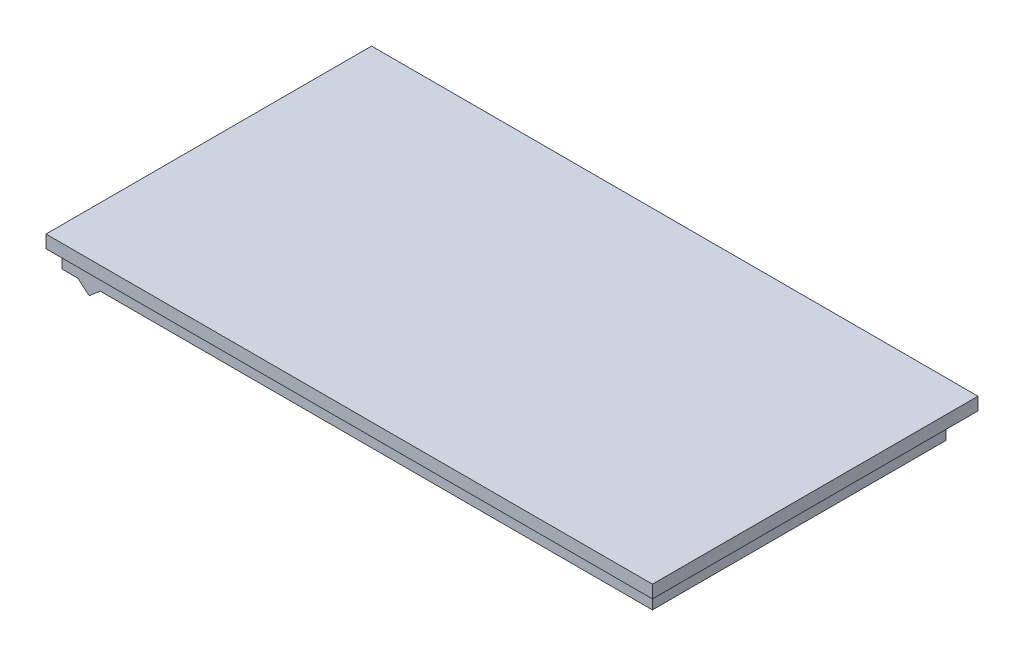
ISO-10303-21;
HEADER;
FILE_DESCRIPTION(('STEP AP214'),'2;1');
FILE_NAME('part.step','',(''),(''),'','','');
FILE_SCHEMA(('AUTOMOTIVE_DESIGN { 1 0 10303 214 1 1 1 1 }'));
ENDSEC;
DATA;
#1=APPLICATION_CONTEXT('core data for automotive mechanical design processes');
#2=APPLICATION_PROTOCOL_DEFINITION('international standard','automotive_design',2000,#1);
#3=PRODUCT_CONTEXT('',#1,'mechanical');
#4=PRODUCT('Part','Part','',(#3));
#5=PRODUCT_RELATED_PRODUCT_CATEGORY('part','',(#4));
#6=PRODUCT_DEFINITION_FORMATION('','',#4);
#7=PRODUCT_DEFINITION_CONTEXT('part definition',#1,'design');
#8=PRODUCT_DEFINITION('design','',#6,#7);
#9=PRODUCT_DEFINITION_SHAPE('','',#8);
#10=(LENGTH_UNIT() NAMED_UNIT(*) SI_UNIT(.MILLI.,.METRE.));
#11=(NAMED_UNIT(*) PLANE_ANGLE_UNIT() SI_UNIT($,.RADIAN.));
#12=(NAMED_UNIT(*) SI_UNIT($,.STERADIAN.) SOLID_ANGLE_UNIT());
#13=UNCERTAINTY_MEASURE_WITH_UNIT(LENGTH_MEASURE(1.E-05),#10,'distance_accuracy_value','');
#14=(GEOMETRIC_REPRESENTATION_CONTEXT(3) GLOBAL_UNCERTAINTY_ASSIGNED_CONTEXT((#13)) GLOBAL_UNIT_ASSIGNED_CONTEXT((#10,
#11,#12)) REPRESENTATION_CONTEXT('',''));
#15=CARTESIAN_POINT('',(0.,0.,0.));
#16=DIRECTION('',(0.,0.,1.));
#17=DIRECTION('',(1.,0.,0.));
#18=AXIS2_PLACEMENT_3D('',#15,#16,#17);
#19=CARTESIAN_POINT('',(0.,-4.,0.));
#20=DIRECTION('',(0.,1.,0.));
#21=DIRECTION('',(0.,0.,1.));
#22=AXIS2_PLACEMENT_3D('',#19,#20,#21);
#23=PLANE('',#22);
#24=DIRECTION('',(0.,0.,-1.));
#25=VECTOR('',#24,1.);
#26=CARTESIAN_POINT('',(2.5,-4.,-44.5));
#27=LINE('',#26,#25);
#28=CARTESIAN_POINT('',(2.5,-4.,-44.5));
#29=VERTEX_POINT('',#28);
#30=CARTESIAN_POINT('',(2.5,-4.,-48.5));
#31=VERTEX_POINT('',#30);
#32=EDGE_CURVE('E454',#29,#31,#27,.T.);
#33=ORIENTED_EDGE('',*,*,#32,.F.);
#34=DIRECTION('',(0.,0.,1.));
#35=VECTOR('',#34,1.);
#36=CARTESIAN_POINT('',(2.5,-4.,-48.5));
#37=LINE('',#36,#35);
#38=CARTESIAN_POINT('',(2.5,-4.,-6.5));
#39=VERTEX_POINT('',#38);
#40=EDGE_CURVE('E390',#29,#39,#37,.T.);
#41=ORIENTED_EDGE('',*,*,#40,.T.);
#42=DIRECTION('',(0.,0.,-1.));
#43=VECTOR('',#42,1.);
#44=CARTESIAN_POINT('',(2.5,-4.,-2.5));
#45=LINE('',#44,#43);
#46=CARTESIAN_POINT('',(2.5,-4.,-2.5));
#47=VERTEX_POINT('',#46);
#48=EDGE_CURVE('E199',#47,#39,#45,.T.);
#49=ORIENTED_EDGE('',*,*,#48,.F.);
#50=DIRECTION('',(-1.,0.,0.));
#51=VECTOR('',#50,1.);
#52=CARTESIAN_POINT('',(2.5,-4.,-2.5));
#53=LINE('',#52,#51);
#54=CARTESIAN_POINT('',(0.,-4.,-2.5));
#55=VERTEX_POINT('',#54);
#56=EDGE_CURVE('E216',#47,#55,#53,.T.);
#57=ORIENTED_EDGE('',*,*,#56,.T.);
#58=DIRECTION('',(0.,0.,1.));
#59=VECTOR('',#58,1.);
#60=CARTESIAN_POINT('',(0.,-4.,-48.5));
#61=LINE('',#60,#59);
#62=CARTESIAN_POINT('',(0.,-4.,-48.5));
#63=VERTEX_POINT('',#62);
#64=EDGE_CURVE('E403',#63,#55,#61,.T.);
#65=ORIENTED_EDGE('',*,*,#64,.F.);
#66=DIRECTION('',(1.,0.,0.));
#67=VECTOR('',#66,1.);
#68=CARTESIAN_POINT('',(2.5,-4.,-48.5));
#69=LINE('',#68,#67);
#70=EDGE_CURVE('E412',#63,#31,#69,.T.);
#71=ORIENTED_EDGE('',*,*,#70,.T.);
#72=EDGE_LOOP('',(#33,#41,#49,#57,#65,#71));
#73=FACE_BOUND('',#72,.T.);
#74=ADVANCED_FACE('F33',(#73),#23,.F.);
#75=DIRECTION('',(0.,0.,1.));
#76=VECTOR('',#75,1.);
#77=CARTESIAN_POINT('',(6.,-4.,-44.5));
#78=LINE('',#77,#76);
#79=CARTESIAN_POINT('',(6.,-4.,-48.5));
#80=VERTEX_POINT('',#79);
#81=CARTESIAN_POINT('',(6.,-4.,-44.5));
#82=VERTEX_POINT('',#81);
#83=EDGE_CURVE('E386',#80,#82,#78,.T.);
#84=ORIENTED_EDGE('',*,*,#83,.F.);
#85=CARTESIAN_POINT('',(92.5,-4.,-48.5));
#86=VERTEX_POINT('',#85);
#87=EDGE_CURVE('E416',#80,#86,#69,.T.);
#88=ORIENTED_EDGE('',*,*,#87,.T.);
#89=DIRECTION('',(0.,0.,1.));
#90=VECTOR('',#89,1.);
#91=CARTESIAN_POINT('',(92.5,-4.,-4.49999999999999));
#92=LINE('',#91,#90);
#93=CARTESIAN_POINT('',(92.5,-4.,-2.49999999999999));
#94=VERTEX_POINT('',#93);
#95=EDGE_CURVE('E213',#86,#94,#92,.T.);
#96=ORIENTED_EDGE('',*,*,#95,.T.);
#97=CARTESIAN_POINT('',(6.,-4.,-2.5));
#98=VERTEX_POINT('',#97);
#99=EDGE_CURVE('E206',#94,#98,#53,.T.);
#100=ORIENTED_EDGE('',*,*,#99,.T.);
#101=DIRECTION('',(0.,0.,1.));
#102=VECTOR('',#101,1.);
#103=CARTESIAN_POINT('',(6.,-4.,-2.5));
#104=LINE('',#103,#102);
#105=CARTESIAN_POINT('',(6.,-4.,-6.5));
#106=VERTEX_POINT('',#105);
#107=EDGE_CURVE('E190',#106,#98,#104,.T.);
#108=ORIENTED_EDGE('',*,*,#107,.F.);
#109=DIRECTION('',(1.,0.,0.));
#110=VECTOR('',#109,1.);
#111=CARTESIAN_POINT('',(2.5,-4.,-6.5));
#112=LINE('',#111,#110);
#113=CARTESIAN_POINT('',(90.5,-4.,-6.49999999999999));
#114=VERTEX_POINT('',#113);
#115=EDGE_CURVE('E57',#106,#114,#112,.T.);
#116=ORIENTED_EDGE('',*,*,#115,.T.);
#117=DIRECTION('',(0.,0.,-1.));
#118=VECTOR('',#117,1.);
#119=CARTESIAN_POINT('',(90.5,-4.,-4.49999999999999));
#120=LINE('',#119,#118);
#121=CARTESIAN_POINT('',(90.5,-4.,-44.5));
#122=VERTEX_POINT('',#121);
#123=EDGE_CURVE('E240',#114,#122,#120,.T.);
#124=ORIENTED_EDGE('',*,*,#123,.T.);
#125=DIRECTION('',(-1.,0.,0.));
#126=VECTOR('',#125,1.);
#127=CARTESIAN_POINT('',(2.5,-4.,-44.5));
#128=LINE('',#127,#126);
#129=EDGE_CURVE('E415',#122,#82,#128,.T.);
#130=ORIENTED_EDGE('',*,*,#129,.T.);
#131=EDGE_LOOP('',(#84,#88,#96,#100,#108,#116,#124,#130));
#132=FACE_BOUND('',#131,.T.);
#133=ADVANCED_FACE('F211',(#132),#23,.F.);
#134=CARTESIAN_POINT('',(0.,0.,0.));
#135=DIRECTION('',(0.,-1.,0.));
#136=DIRECTION('',(0.,0.,-1.));
#137=AXIS2_PLACEMENT_3D('',#134,#135,#136);
#138=PLANE('',#137);
#139=DIRECTION('',(1.,0.,0.));
#140=VECTOR('',#139,1.);
#141=CARTESIAN_POINT('',(2.5,0.,-6.5));
#142=LINE('',#141,#140);
#143=CARTESIAN_POINT('',(2.5,0.,-6.5));
#144=VERTEX_POINT('',#143);
#145=CARTESIAN_POINT('',(90.5,0.,-6.49999999999999));
#146=VERTEX_POINT('',#145);
#147=EDGE_CURVE('E262',#144,#146,#142,.T.);
#148=ORIENTED_EDGE('',*,*,#147,.F.);
#149=DIRECTION('',(0.,0.,-1.));
#150=VECTOR('',#149,1.);
#151=CARTESIAN_POINT('',(2.5,0.,-48.5));
#152=LINE('',#151,#150);
#153=CARTESIAN_POINT('',(2.5,0.,-44.5));
#154=VERTEX_POINT('',#153);
#155=EDGE_CURVE('E401',#144,#154,#152,.T.);
#156=ORIENTED_EDGE('',*,*,#155,.T.);
#157=DIRECTION('',(-1.,0.,0.));
#158=VECTOR('',#157,1.);
#159=CARTESIAN_POINT('',(2.5,0.,-44.5));
#160=LINE('',#159,#158);
#161=CARTESIAN_POINT('',(90.5,0.,-44.5));
#162=VERTEX_POINT('',#161);
#163=EDGE_CURVE('E251',#162,#154,#160,.T.);
#164=ORIENTED_EDGE('',*,*,#163,.F.);
#165=DIRECTION('',(0.,0.,-1.));
#166=VECTOR('',#165,1.);
#167=CARTESIAN_POINT('',(90.5,0.,-4.49999999999999));
#168=LINE('',#167,#166);
#169=EDGE_CURVE('E218',#146,#162,#168,.T.);
#170=ORIENTED_EDGE('',*,*,#169,.F.);
#171=EDGE_LOOP('',(#148,#156,#164,#170));
#172=FACE_BOUND('',#171,.T.);
#173=ADVANCED_FACE('F353',(#172),#138,.T.);
#174=CARTESIAN_POINT('',(90.5,-4.,-4.49999999999999));
#175=DIRECTION('',(1.,0.,0.));
#176=DIRECTION('',(0.,0.,-1.));
#177=AXIS2_PLACEMENT_3D('',#174,#175,#176);
#178=PLANE('',#177);
#179=DIRECTION('',(0.,-1.,0.));
#180=VECTOR('',#179,1.);
#181=CARTESIAN_POINT('',(90.5,-2.,-44.5));
#182=LINE('',#181,#180);
#183=EDGE_CURVE('E50',#162,#122,#182,.T.);
#184=ORIENTED_EDGE('',*,*,#183,.T.);
#185=ORIENTED_EDGE('',*,*,#123,.F.);
#186=DIRECTION('',(0.,1.,0.));
#187=VECTOR('',#186,1.);
#188=CARTESIAN_POINT('',(90.5,-2.,-6.49999999999999));
#189=LINE('',#188,#187);
#190=EDGE_CURVE('E244',#114,#146,#189,.T.);
#191=ORIENTED_EDGE('',*,*,#190,.T.);
#192=ORIENTED_EDGE('',*,*,#169,.T.);
#193=EDGE_LOOP('',(#184,#185,#191,#192));
#194=FACE_BOUND('',#193,.T.);
#195=ADVANCED_FACE('F358',(#194),#178,.F.);
#196=CARTESIAN_POINT('',(2.5,-2.,-46.5));
#197=DIRECTION('',(0.,0.,1.));
#198=DIRECTION('',(1.,0.,0.));
#199=AXIS2_PLACEMENT_3D('',#196,#197,#198);
#200=PLANE('',#199);
#201=DIRECTION('',(0.,1.,0.));
#202=VECTOR('',#201,1.);
#203=CARTESIAN_POINT('',(92.5,-2.,-46.5));
#204=LINE('',#203,#202);
#205=CARTESIAN_POINT('',(92.5,-2.,-46.5));
#206=VERTEX_POINT('',#205);
#207=CARTESIAN_POINT('',(92.5,0.,-46.5));
#208=VERTEX_POINT('',#207);
#209=EDGE_CURVE('E257',#206,#208,#204,.T.);
#210=ORIENTED_EDGE('',*,*,#209,.F.);
#211=DIRECTION('',(1.,0.,0.));
#212=VECTOR('',#211,1.);
#213=CARTESIAN_POINT('',(2.5,-2.,-46.5));
#214=LINE('',#213,#212);
#215=CARTESIAN_POINT('',(2.5,-2.,-46.5));
#216=VERTEX_POINT('',#215);
#217=EDGE_CURVE('E248',#216,#206,#214,.T.);
#218=ORIENTED_EDGE('',*,*,#217,.F.);
#219=DIRECTION('',(0.,1.,0.));
#220=VECTOR('',#219,1.);
#221=CARTESIAN_POINT('',(2.5,-2.,-46.5));
#222=LINE('',#221,#220);
#223=CARTESIAN_POINT('',(2.5,0.,-46.5));
#224=VERTEX_POINT('',#223);
#225=EDGE_CURVE('E259',#216,#224,#222,.T.);
#226=ORIENTED_EDGE('',*,*,#225,.T.);
#227=DIRECTION('',(1.,0.,0.));
#228=VECTOR('',#227,1.);
#229=CARTESIAN_POINT('',(2.5,0.,-46.5));
#230=LINE('',#229,#228);
#231=EDGE_CURVE('E247',#224,#208,#230,.T.);
#232=ORIENTED_EDGE('',*,*,#231,.T.);
#233=EDGE_LOOP('',(#210,#218,#226,#232));
#234=FACE_BOUND('',#233,.T.);
#235=ADVANCED_FACE('F361',(#234),#200,.F.);
#236=DIRECTION('',(-1.,0.,0.));
#237=VECTOR('',#236,1.);
#238=CARTESIAN_POINT('',(2.5,0.,-2.5));
#239=LINE('',#238,#237);
#240=CARTESIAN_POINT('',(2.5,0.,-2.5));
#241=VERTEX_POINT('',#240);
#242=CARTESIAN_POINT('',(0.,0.,-2.5));
#243=VERTEX_POINT('',#242);
#244=EDGE_CURVE('E400',#241,#243,#239,.T.);
#245=ORIENTED_EDGE('',*,*,#244,.F.);
#246=CARTESIAN_POINT('',(2.5,0.,-4.5));
#247=VERTEX_POINT('',#246);
#248=EDGE_CURVE('E397',#241,#247,#152,.T.);
#249=ORIENTED_EDGE('',*,*,#248,.T.);
#250=DIRECTION('',(-1.,0.,0.));
#251=VECTOR('',#250,1.);
#252=CARTESIAN_POINT('',(2.5,0.,-4.5));
#253=LINE('',#252,#251);
#254=CARTESIAN_POINT('',(92.5,0.,-4.49999999999999));
#255=VERTEX_POINT('',#254);
#256=EDGE_CURVE('E267',#255,#247,#253,.T.);
#257=ORIENTED_EDGE('',*,*,#256,.F.);
#258=DIRECTION('',(0.,0.,1.));
#259=VECTOR('',#258,1.);
#260=CARTESIAN_POINT('',(92.5,0.,-6.49999999999999));
#261=LINE('',#260,#259);
#262=EDGE_CURVE('E270',#208,#255,#261,.T.);
#263=ORIENTED_EDGE('',*,*,#262,.F.);
#264=ORIENTED_EDGE('',*,*,#231,.F.);
#265=CARTESIAN_POINT('',(2.5,0.,-48.5));
#266=VERTEX_POINT('',#265);
#267=EDGE_CURVE('E396',#224,#266,#152,.T.);
#268=ORIENTED_EDGE('',*,*,#267,.T.);
#269=DIRECTION('',(-1.,0.,0.));
#270=VECTOR('',#269,1.);
#271=CARTESIAN_POINT('',(2.5,0.,-48.5));
#272=LINE('',#271,#270);
#273=CARTESIAN_POINT('',(0.,0.,-48.5));
#274=VERTEX_POINT('',#273);
#275=EDGE_CURVE('E408',#266,#274,#272,.T.);
#276=ORIENTED_EDGE('',*,*,#275,.T.);
#277=DIRECTION('',(0.,0.,1.));
#278=VECTOR('',#277,1.);
#279=CARTESIAN_POINT('',(0.,0.,0.));
#280=LINE('',#279,#278);
#281=CARTESIAN_POINT('',(0.,0.,-51.));
#282=VERTEX_POINT('',#281);
#283=EDGE_CURVE('E286',#282,#274,#280,.T.);
#284=ORIENTED_EDGE('',*,*,#283,.F.);
#285=DIRECTION('',(-1.,0.,0.));
#286=VECTOR('',#285,1.);
#287=CARTESIAN_POINT('',(0.,0.,-51.));
#288=LINE('',#287,#286);
#289=CARTESIAN_POINT('',(95.,0.,-51.));
#290=VERTEX_POINT('',#289);
#291=EDGE_CURVE('E297',#290,#282,#288,.T.);
#292=ORIENTED_EDGE('',*,*,#291,.F.);
#293=DIRECTION('',(0.,0.,-1.));
#294=VECTOR('',#293,1.);
#295=CARTESIAN_POINT('',(95.,0.,-51.));
#296=LINE('',#295,#294);
#297=CARTESIAN_POINT('',(95.,0.,0.));
#298=VERTEX_POINT('',#297);
#299=EDGE_CURVE('E295',#298,#290,#296,.T.);
#300=ORIENTED_EDGE('',*,*,#299,.F.);
#301=DIRECTION('',(1.,0.,0.));
#302=VECTOR('',#301,1.);
#303=CARTESIAN_POINT('',(95.,0.,0.));
#304=LINE('',#303,#302);
#305=CARTESIAN_POINT('',(0.,0.,0.));
#306=VERTEX_POINT('',#305);
#307=EDGE_CURVE('E281',#306,#298,#304,.T.);
#308=ORIENTED_EDGE('',*,*,#307,.F.);
#309=EDGE_CURVE('E299',#243,#306,#280,.T.);
#310=ORIENTED_EDGE('',*,*,#309,.F.);
#311=EDGE_LOOP('',(#245,#249,#257,#263,#264,#268,#276,#284,#292,#300,#308,#310));
#312=FACE_BOUND('',#311,.T.);
#313=ADVANCED_FACE('F323',(#312),#138,.T.);
#314=CARTESIAN_POINT('',(2.5,-2.,-6.5));
#315=DIRECTION('',(0.,0.,1.));
#316=DIRECTION('',(1.,0.,0.));
#317=AXIS2_PLACEMENT_3D('',#314,#315,#316);
#318=PLANE('',#317);
#319=ORIENTED_EDGE('',*,*,#115,.F.);
#320=DIRECTION('',(-0.759256602365297,-0.650791373455968,0.));
#321=VECTOR('',#320,1.);
#322=CARTESIAN_POINT('',(4.97058823529412,-4.88235294117647,-6.5));
#323=LINE('',#322,#321);
#324=CARTESIAN_POINT('',(4.25,-5.5,-6.5));
#325=VERTEX_POINT('',#324);
#326=EDGE_CURVE('E196',#106,#325,#323,.T.);
#327=ORIENTED_EDGE('',*,*,#326,.T.);
#328=DIRECTION('',(-0.759256602365297,0.650791373455968,0.));
#329=VECTOR('',#328,1.);
#330=CARTESIAN_POINT('',(1.51176470588235,-3.15294117647059,-6.5));
#331=LINE('',#330,#329);
#332=EDGE_CURVE('E457',#325,#39,#331,.T.);
#333=ORIENTED_EDGE('',*,*,#332,.T.);
#334=DIRECTION('',(0.,1.,0.));
#335=VECTOR('',#334,1.);
#336=CARTESIAN_POINT('',(2.5,-2.,-6.5));
#337=LINE('',#336,#335);
#338=EDGE_CURVE('E278',#39,#144,#337,.T.);
#339=ORIENTED_EDGE('',*,*,#338,.T.);
#340=ORIENTED_EDGE('',*,*,#147,.T.);
#341=ORIENTED_EDGE('',*,*,#190,.F.);
#342=EDGE_LOOP('',(#319,#327,#333,#339,#340,#341));
#343=FACE_BOUND('',#342,.T.);
#344=ADVANCED_FACE('F365',(#343),#318,.F.);
#345=CARTESIAN_POINT('',(2.5,-2.,-44.5));
#346=DIRECTION('',(0.,0.,-1.));
#347=DIRECTION('',(-1.,0.,0.));
#348=AXIS2_PLACEMENT_3D('',#345,#346,#347);
#349=PLANE('',#348);
#350=DIRECTION('',(0.759256602365297,-0.650791373455968,0.));
#351=VECTOR('',#350,1.);
#352=CARTESIAN_POINT('',(1.51176470588235,-3.15294117647059,-44.5));
#353=LINE('',#352,#351);
#354=CARTESIAN_POINT('',(4.25,-5.5,-44.5));
#355=VERTEX_POINT('',#354);
#356=EDGE_CURVE('E461',#29,#355,#353,.T.);
#357=ORIENTED_EDGE('',*,*,#356,.T.);
#358=DIRECTION('',(0.759256602365297,0.650791373455968,0.));
#359=VECTOR('',#358,1.);
#360=CARTESIAN_POINT('',(4.97058823529412,-4.88235294117647,-44.5));
#361=LINE('',#360,#359);
#362=EDGE_CURVE('E473',#355,#82,#361,.T.);
#363=ORIENTED_EDGE('',*,*,#362,.T.);
#364=ORIENTED_EDGE('',*,*,#129,.F.);
#365=ORIENTED_EDGE('',*,*,#183,.F.);
#366=ORIENTED_EDGE('',*,*,#163,.T.);
#367=DIRECTION('',(0.,1.,0.));
#368=VECTOR('',#367,1.);
#369=CARTESIAN_POINT('',(2.5,-2.,-44.5));
#370=LINE('',#369,#368);
#371=EDGE_CURVE('E250',#29,#154,#370,.T.);
#372=ORIENTED_EDGE('',*,*,#371,.F.);
#373=EDGE_LOOP('',(#357,#363,#364,#365,#366,#372));
#374=FACE_BOUND('',#373,.T.);
#375=ADVANCED_FACE('F362',(#374),#349,.F.);
#376=CARTESIAN_POINT('',(95.,2.,0.));
#377=DIRECTION('',(0.,0.,-1.));
#378=DIRECTION('',(-1.,0.,0.));
#379=AXIS2_PLACEMENT_3D('',#376,#377,#378);
#380=PLANE('',#379);
#381=ORIENTED_EDGE('',*,*,#307,.T.);
#382=DIRECTION('',(0.,-1.,0.));
#383=VECTOR('',#382,1.);
#384=CARTESIAN_POINT('',(95.,2.,0.));
#385=LINE('',#384,#383);
#386=CARTESIAN_POINT('',(95.,2.,0.));
#387=VERTEX_POINT('',#386);
#388=EDGE_CURVE('E42',#387,#298,#385,.T.);
#389=ORIENTED_EDGE('',*,*,#388,.F.);
#390=DIRECTION('',(1.,0.,0.));
#391=VECTOR('',#390,1.);
#392=CARTESIAN_POINT('',(95.,2.,0.));
#393=LINE('',#392,#391);
#394=CARTESIAN_POINT('',(0.,2.,0.));
#395=VERTEX_POINT('',#394);
#396=EDGE_CURVE('E282',#395,#387,#393,.T.);
#397=ORIENTED_EDGE('',*,*,#396,.F.);
#398=DIRECTION('',(0.,-1.,0.));
#399=VECTOR('',#398,1.);
#400=CARTESIAN_POINT('',(0.,2.,0.));
#401=LINE('',#400,#399);
#402=EDGE_CURVE('E292',#395,#306,#401,.T.);
#403=ORIENTED_EDGE('',*,*,#402,.T.);
#404=EDGE_LOOP('',(#381,#389,#397,#403));
#405=FACE_BOUND('',#404,.T.);
#406=ADVANCED_FACE('F35',(#405),#380,.F.);
#407=CARTESIAN_POINT('',(95.,2.,-51.));
#408=DIRECTION('',(-1.,0.,0.));
#409=DIRECTION('',(0.,0.,1.));
#410=AXIS2_PLACEMENT_3D('',#407,#408,#409);
#411=PLANE('',#410);
#412=ORIENTED_EDGE('',*,*,#299,.T.);
#413=DIRECTION('',(0.,-1.,0.));
#414=VECTOR('',#413,1.);
#415=CARTESIAN_POINT('',(95.,2.,-51.));
#416=LINE('',#415,#414);
#417=CARTESIAN_POINT('',(95.,2.,-51.));
#418=VERTEX_POINT('',#417);
#419=EDGE_CURVE('E306',#418,#290,#416,.T.);
#420=ORIENTED_EDGE('',*,*,#419,.F.);
#421=DIRECTION('',(0.,0.,-1.));
#422=VECTOR('',#421,1.);
#423=CARTESIAN_POINT('',(95.,2.,-51.));
#424=LINE('',#423,#422);
#425=EDGE_CURVE('E285',#387,#418,#424,.T.);
#426=ORIENTED_EDGE('',*,*,#425,.F.);
#427=ORIENTED_EDGE('',*,*,#388,.T.);
#428=EDGE_LOOP('',(#412,#420,#426,#427));
#429=FACE_BOUND('',#428,.T.);
#430=ADVANCED_FACE('F315',(#429),#411,.F.);
#431=CARTESIAN_POINT('',(0.,2.,-51.));
#432=DIRECTION('',(0.,0.,1.));
#433=DIRECTION('',(1.,0.,0.));
#434=AXIS2_PLACEMENT_3D('',#431,#432,#433);
#435=PLANE('',#434);
#436=ORIENTED_EDGE('',*,*,#291,.T.);
#437=DIRECTION('',(0.,-1.,0.));
#438=VECTOR('',#437,1.);
#439=CARTESIAN_POINT('',(0.,2.,-51.));
#440=LINE('',#439,#438);
#441=CARTESIAN_POINT('',(0.,2.,-51.));
#442=VERTEX_POINT('',#441);
#443=EDGE_CURVE('E304',#442,#282,#440,.T.);
#444=ORIENTED_EDGE('',*,*,#443,.F.);
#445=DIRECTION('',(-1.,0.,0.));
#446=VECTOR('',#445,1.);
#447=CARTESIAN_POINT('',(0.,2.,-51.));
#448=LINE('',#447,#446);
#449=EDGE_CURVE('E288',#418,#442,#448,.T.);
#450=ORIENTED_EDGE('',*,*,#449,.F.);
#451=ORIENTED_EDGE('',*,*,#419,.T.);
#452=EDGE_LOOP('',(#436,#444,#450,#451));
#453=FACE_BOUND('',#452,.T.);
#454=ADVANCED_FACE('F327',(#453),#435,.F.);
#455=CARTESIAN_POINT('',(0.,2.,0.));
#456=DIRECTION('',(1.,0.,0.));
#457=DIRECTION('',(0.,0.,-1.));
#458=AXIS2_PLACEMENT_3D('',#455,#456,#457);
#459=PLANE('',#458);
#460=ORIENTED_EDGE('',*,*,#283,.T.);
#461=DIRECTION('',(0.,-1.,0.));
#462=VECTOR('',#461,1.);
#463=CARTESIAN_POINT('',(0.,0.,-48.5));
#464=LINE('',#463,#462);
#465=EDGE_CURVE('E198',#274,#63,#464,.T.);
#466=ORIENTED_EDGE('',*,*,#465,.T.);
#467=ORIENTED_EDGE('',*,*,#64,.T.);
#468=DIRECTION('',(0.,1.,0.));
#469=VECTOR('',#468,1.);
#470=CARTESIAN_POINT('',(0.,0.,-2.5));
#471=LINE('',#470,#469);
#472=EDGE_CURVE('E391',#55,#243,#471,.T.);
#473=ORIENTED_EDGE('',*,*,#472,.T.);
#474=ORIENTED_EDGE('',*,*,#309,.T.);
#475=ORIENTED_EDGE('',*,*,#402,.F.);
#476=DIRECTION('',(0.,0.,1.));
#477=VECTOR('',#476,1.);
#478=CARTESIAN_POINT('',(0.,2.,0.));
#479=LINE('',#478,#477);
#480=EDGE_CURVE('E290',#442,#395,#479,.T.);
#481=ORIENTED_EDGE('',*,*,#480,.F.);
#482=ORIENTED_EDGE('',*,*,#443,.T.);
#483=EDGE_LOOP('',(#460,#466,#467,#473,#474,#475,#481,#482));
#484=FACE_BOUND('',#483,.T.);
#485=ADVANCED_FACE('F330',(#484),#459,.F.);
#486=CARTESIAN_POINT('',(0.,2.,0.));
#487=DIRECTION('',(0.,-1.,0.));
#488=DIRECTION('',(0.,0.,-1.));
#489=AXIS2_PLACEMENT_3D('',#486,#487,#488);
#490=PLANE('',#489);
#491=ORIENTED_EDGE('',*,*,#396,.T.);
#492=ORIENTED_EDGE('',*,*,#425,.T.);
#493=ORIENTED_EDGE('',*,*,#449,.T.);
#494=ORIENTED_EDGE('',*,*,#480,.T.);
#495=EDGE_LOOP('',(#491,#492,#493,#494));
#496=FACE_BOUND('',#495,.T.);
#497=ADVANCED_FACE('F333',(#496),#490,.F.);
#498=CARTESIAN_POINT('',(92.5,-2.,-6.49999999999999));
#499=DIRECTION('',(-1.,0.,0.));
#500=DIRECTION('',(0.,0.,1.));
#501=AXIS2_PLACEMENT_3D('',#498,#499,#500);
#502=PLANE('',#501);
#503=DIRECTION('',(0.,1.,0.));
#504=VECTOR('',#503,1.);
#505=CARTESIAN_POINT('',(92.5,-4.,-2.49999999999999));
#506=LINE('',#505,#504);
#507=CARTESIAN_POINT('',(92.5,-2.,-2.49999999999999));
#508=VERTEX_POINT('',#507);
#509=EDGE_CURVE('E215',#94,#508,#506,.T.);
#510=ORIENTED_EDGE('',*,*,#509,.F.);
#511=ORIENTED_EDGE('',*,*,#95,.F.);
#512=DIRECTION('',(0.,1.,0.));
#513=VECTOR('',#512,1.);
#514=CARTESIAN_POINT('',(92.5,-4.,-48.5));
#515=LINE('',#514,#513);
#516=CARTESIAN_POINT('',(92.5,-2.,-48.5));
#517=VERTEX_POINT('',#516);
#518=EDGE_CURVE('E234',#86,#517,#515,.T.);
#519=ORIENTED_EDGE('',*,*,#518,.T.);
#520=DIRECTION('',(0.,0.,1.));
#521=VECTOR('',#520,1.);
#522=CARTESIAN_POINT('',(92.5,-2.,-44.5));
#523=LINE('',#522,#521);
#524=EDGE_CURVE('E423',#517,#206,#523,.T.);
#525=ORIENTED_EDGE('',*,*,#524,.T.);
#526=ORIENTED_EDGE('',*,*,#209,.T.);
#527=ORIENTED_EDGE('',*,*,#262,.T.);
#528=DIRECTION('',(0.,1.,0.));
#529=VECTOR('',#528,1.);
#530=CARTESIAN_POINT('',(92.5,-2.,-4.49999999999999));
#531=LINE('',#530,#529);
#532=CARTESIAN_POINT('',(92.5,-2.,-4.49999999999999));
#533=VERTEX_POINT('',#532);
#534=EDGE_CURVE('E276',#533,#255,#531,.T.);
#535=ORIENTED_EDGE('',*,*,#534,.F.);
#536=DIRECTION('',(0.,0.,1.));
#537=VECTOR('',#536,1.);
#538=CARTESIAN_POINT('',(92.5,-2.,-6.49999999999999));
#539=LINE('',#538,#537);
#540=EDGE_CURVE('E233',#533,#508,#539,.T.);
#541=ORIENTED_EDGE('',*,*,#540,.T.);
#542=EDGE_LOOP('',(#510,#511,#519,#525,#526,#527,#535,#541));
#543=FACE_BOUND('',#542,.T.);
#544=ADVANCED_FACE('F335',(#543),#502,.F.);
#545=CARTESIAN_POINT('',(2.5,-2.,-4.5));
#546=DIRECTION('',(0.,0.,-1.));
#547=DIRECTION('',(-1.,0.,0.));
#548=AXIS2_PLACEMENT_3D('',#545,#546,#547);
#549=PLANE('',#548);
#550=DIRECTION('',(-1.,0.,0.));
#551=VECTOR('',#550,1.);
#552=CARTESIAN_POINT('',(2.5,-2.,-4.5));
#553=LINE('',#552,#551);
#554=CARTESIAN_POINT('',(2.5,-2.,-4.49999999999999));
#555=VERTEX_POINT('',#554);
#556=EDGE_CURVE('E263',#533,#555,#553,.T.);
#557=ORIENTED_EDGE('',*,*,#556,.F.);
#558=ORIENTED_EDGE('',*,*,#534,.T.);
#559=ORIENTED_EDGE('',*,*,#256,.T.);
#560=DIRECTION('',(0.,1.,0.));
#561=VECTOR('',#560,1.);
#562=CARTESIAN_POINT('',(2.5,-2.,-4.5));
#563=LINE('',#562,#561);
#564=EDGE_CURVE('E266',#555,#247,#563,.T.);
#565=ORIENTED_EDGE('',*,*,#564,.F.);
#566=EDGE_LOOP('',(#557,#558,#559,#565));
#567=FACE_BOUND('',#566,.T.);
#568=ADVANCED_FACE('F341',(#567),#549,.F.);
#569=CARTESIAN_POINT('',(0.,-2.,0.));
#570=DIRECTION('',(0.,1.,0.));
#571=DIRECTION('',(0.,0.,1.));
#572=AXIS2_PLACEMENT_3D('',#569,#570,#571);
#573=PLANE('',#572);
#574=ORIENTED_EDGE('',*,*,#556,.T.);
#575=DIRECTION('',(0.,0.,-1.));
#576=VECTOR('',#575,1.);
#577=CARTESIAN_POINT('',(2.5,-2.,-6.5));
#578=LINE('',#577,#576);
#579=CARTESIAN_POINT('',(2.5,-2.,-2.5));
#580=VERTEX_POINT('',#579);
#581=EDGE_CURVE('E230',#580,#555,#578,.T.);
#582=ORIENTED_EDGE('',*,*,#581,.F.);
#583=DIRECTION('',(-1.,0.,0.));
#584=VECTOR('',#583,1.);
#585=CARTESIAN_POINT('',(2.5,-2.,-2.5));
#586=LINE('',#585,#584);
#587=EDGE_CURVE('E236',#508,#580,#586,.T.);
#588=ORIENTED_EDGE('',*,*,#587,.F.);
#589=ORIENTED_EDGE('',*,*,#540,.F.);
#590=EDGE_LOOP('',(#574,#582,#588,#589));
#591=FACE_BOUND('',#590,.T.);
#592=ADVANCED_FACE('F371',(#591),#573,.T.);
#593=CARTESIAN_POINT('',(2.5,-4.,-2.5));
#594=DIRECTION('',(0.,0.,-1.));
#595=DIRECTION('',(-1.,0.,0.));
#596=AXIS2_PLACEMENT_3D('',#593,#594,#595);
#597=PLANE('',#596);
#598=DIRECTION('',(-0.759256602365297,0.650791373455968,0.));
#599=VECTOR('',#598,1.);
#600=CARTESIAN_POINT('',(2.5,-4.,-2.5));
#601=LINE('',#600,#599);
#602=CARTESIAN_POINT('',(4.25,-5.5,-2.5));
#603=VERTEX_POINT('',#602);
#604=EDGE_CURVE('E208',#603,#47,#601,.T.);
#605=ORIENTED_EDGE('',*,*,#604,.F.);
#606=DIRECTION('',(-0.759256602365297,-0.650791373455968,0.));
#607=VECTOR('',#606,1.);
#608=CARTESIAN_POINT('',(4.25,-5.5,-2.5));
#609=LINE('',#608,#607);
#610=EDGE_CURVE('E193',#98,#603,#609,.T.);
#611=ORIENTED_EDGE('',*,*,#610,.F.);
#612=ORIENTED_EDGE('',*,*,#99,.F.);
#613=ORIENTED_EDGE('',*,*,#509,.T.);
#614=ORIENTED_EDGE('',*,*,#587,.T.);
#615=DIRECTION('',(0.,1.,0.));
#616=VECTOR('',#615,1.);
#617=CARTESIAN_POINT('',(2.5,0.,-2.5));
#618=LINE('',#617,#616);
#619=EDGE_CURVE('E394',#580,#241,#618,.T.);
#620=ORIENTED_EDGE('',*,*,#619,.T.);
#621=ORIENTED_EDGE('',*,*,#244,.T.);
#622=ORIENTED_EDGE('',*,*,#472,.F.);
#623=ORIENTED_EDGE('',*,*,#56,.F.);
#624=EDGE_LOOP('',(#605,#611,#612,#613,#614,#620,#621,#622,#623));
#625=FACE_BOUND('',#624,.T.);
#626=ADVANCED_FACE('F204',(#625),#597,.F.);
#627=CARTESIAN_POINT('',(0.,-2.,0.));
#628=DIRECTION('',(0.,-1.,0.));
#629=DIRECTION('',(0.,0.,-1.));
#630=AXIS2_PLACEMENT_3D('',#627,#628,#629);
#631=PLANE('',#630);
#632=DIRECTION('',(0.,0.,-1.));
#633=VECTOR('',#632,1.);
#634=CARTESIAN_POINT('',(2.5,-2.,-44.5));
#635=LINE('',#634,#633);
#636=CARTESIAN_POINT('',(2.5,-2.,-48.5));
#637=VERTEX_POINT('',#636);
#638=EDGE_CURVE('E410',#216,#637,#635,.T.);
#639=ORIENTED_EDGE('',*,*,#638,.F.);
#640=ORIENTED_EDGE('',*,*,#217,.T.);
#641=ORIENTED_EDGE('',*,*,#524,.F.);
#642=DIRECTION('',(1.,0.,0.));
#643=VECTOR('',#642,1.);
#644=CARTESIAN_POINT('',(2.5,-2.,-48.5));
#645=LINE('',#644,#643);
#646=EDGE_CURVE('E421',#637,#517,#645,.T.);
#647=ORIENTED_EDGE('',*,*,#646,.F.);
#648=EDGE_LOOP('',(#639,#640,#641,#647));
#649=FACE_BOUND('',#648,.T.);
#650=ADVANCED_FACE('F433',(#649),#631,.F.);
#651=CARTESIAN_POINT('',(2.5,-4.,-48.5));
#652=DIRECTION('',(0.,0.,1.));
#653=DIRECTION('',(1.,0.,0.));
#654=AXIS2_PLACEMENT_3D('',#651,#652,#653);
#655=PLANE('',#654);
#656=ORIENTED_EDGE('',*,*,#87,.F.);
#657=DIRECTION('',(-0.759256602365297,-0.650791373455968,0.));
#658=VECTOR('',#657,1.);
#659=CARTESIAN_POINT('',(3.98235294117647,-5.72941176470588,-48.5));
#660=LINE('',#659,#658);
#661=CARTESIAN_POINT('',(4.25,-5.5,-48.5));
#662=VERTEX_POINT('',#661);
#663=EDGE_CURVE('E209',#80,#662,#660,.T.);
#664=ORIENTED_EDGE('',*,*,#663,.T.);
#665=DIRECTION('',(-0.759256602365297,0.650791373455968,0.));
#666=VECTOR('',#665,1.);
#667=CARTESIAN_POINT('',(2.5,-4.,-48.5));
#668=LINE('',#667,#666);
#669=EDGE_CURVE('E466',#662,#31,#668,.T.);
#670=ORIENTED_EDGE('',*,*,#669,.T.);
#671=ORIENTED_EDGE('',*,*,#70,.F.);
#672=ORIENTED_EDGE('',*,*,#465,.F.);
#673=ORIENTED_EDGE('',*,*,#275,.F.);
#674=DIRECTION('',(0.,-1.,0.));
#675=VECTOR('',#674,1.);
#676=CARTESIAN_POINT('',(2.5,0.,-48.5));
#677=LINE('',#676,#675);
#678=EDGE_CURVE('E388',#266,#637,#677,.T.);
#679=ORIENTED_EDGE('',*,*,#678,.T.);
#680=ORIENTED_EDGE('',*,*,#646,.T.);
#681=ORIENTED_EDGE('',*,*,#518,.F.);
#682=EDGE_LOOP('',(#656,#664,#670,#671,#672,#673,#679,#680,#681));
#683=FACE_BOUND('',#682,.T.);
#684=ADVANCED_FACE('F476',(#683),#655,.F.);
#685=CARTESIAN_POINT('',(2.5,0.,0.));
#686=DIRECTION('',(-1.,0.,0.));
#687=DIRECTION('',(0.,0.,1.));
#688=AXIS2_PLACEMENT_3D('',#685,#686,#687);
#689=PLANE('',#688);
#690=ORIENTED_EDGE('',*,*,#155,.F.);
#691=ORIENTED_EDGE('',*,*,#338,.F.);
#692=ORIENTED_EDGE('',*,*,#40,.F.);
#693=ORIENTED_EDGE('',*,*,#371,.T.);
#694=EDGE_LOOP('',(#690,#691,#692,#693));
#695=FACE_BOUND('',#694,.T.);
#696=ADVANCED_FACE('F483',(#695),#689,.F.);
#697=ORIENTED_EDGE('',*,*,#581,.T.);
#698=ORIENTED_EDGE('',*,*,#564,.T.);
#699=ORIENTED_EDGE('',*,*,#248,.F.);
#700=ORIENTED_EDGE('',*,*,#619,.F.);
#701=EDGE_LOOP('',(#697,#698,#699,#700));
#702=FACE_BOUND('',#701,.T.);
#703=ADVANCED_FACE('F448',(#702),#689,.F.);
#704=ORIENTED_EDGE('',*,*,#267,.F.);
#705=ORIENTED_EDGE('',*,*,#225,.F.);
#706=ORIENTED_EDGE('',*,*,#638,.T.);
#707=ORIENTED_EDGE('',*,*,#678,.F.);
#708=EDGE_LOOP('',(#704,#705,#706,#707));
#709=FACE_BOUND('',#708,.T.);
#710=ADVANCED_FACE('F489',(#709),#689,.F.);
#711=CARTESIAN_POINT('',(2.5,-4.,-55.));
#712=DIRECTION('',(0.650791373455968,0.759256602365297,0.));
#713=DIRECTION('',(-0.759256602365297,0.650791373455968,0.));
#714=AXIS2_PLACEMENT_3D('',#711,#712,#713);
#715=PLANE('',#714);
#716=ORIENTED_EDGE('',*,*,#32,.T.);
#717=ORIENTED_EDGE('',*,*,#669,.F.);
#718=DIRECTION('',(0.,0.,1.));
#719=VECTOR('',#718,1.);
#720=CARTESIAN_POINT('',(4.25,-5.5,0.));
#721=LINE('',#720,#719);
#722=EDGE_CURVE('E11',#662,#355,#721,.T.);
#723=ORIENTED_EDGE('',*,*,#722,.T.);
#724=ORIENTED_EDGE('',*,*,#356,.F.);
#725=EDGE_LOOP('',(#716,#717,#723,#724));
#726=FACE_BOUND('',#725,.T.);
#727=ADVANCED_FACE('F477',(#726),#715,.F.);
#728=DIRECTION('',(0.,0.,1.));
#729=VECTOR('',#728,1.);
#730=CARTESIAN_POINT('',(4.25,-5.5,-55.));
#731=LINE('',#730,#729);
#732=EDGE_CURVE('E468',#325,#603,#731,.T.);
#733=ORIENTED_EDGE('',*,*,#732,.T.);
#734=ORIENTED_EDGE('',*,*,#604,.T.);
#735=ORIENTED_EDGE('',*,*,#48,.T.);
#736=ORIENTED_EDGE('',*,*,#332,.F.);
#737=EDGE_LOOP('',(#733,#734,#735,#736));
#738=FACE_BOUND('',#737,.T.);
#739=ADVANCED_FACE('F496',(#738),#715,.F.);
#740=CARTESIAN_POINT('',(4.25,-5.5,-65.));
#741=DIRECTION('',(-0.650791373455968,0.759256602365297,0.));
#742=DIRECTION('',(-0.759256602365297,-0.650791373455968,0.));
#743=AXIS2_PLACEMENT_3D('',#740,#741,#742);
#744=PLANE('',#743);
#745=ORIENTED_EDGE('',*,*,#107,.T.);
#746=ORIENTED_EDGE('',*,*,#610,.T.);
#747=ORIENTED_EDGE('',*,*,#732,.F.);
#748=ORIENTED_EDGE('',*,*,#326,.F.);
#749=EDGE_LOOP('',(#745,#746,#747,#748));
#750=FACE_BOUND('',#749,.T.);
#751=ADVANCED_FACE('F192',(#750),#744,.F.);
#752=ORIENTED_EDGE('',*,*,#722,.F.);
#753=ORIENTED_EDGE('',*,*,#663,.F.);
#754=ORIENTED_EDGE('',*,*,#83,.T.);
#755=ORIENTED_EDGE('',*,*,#362,.F.);
#756=EDGE_LOOP('',(#752,#753,#754,#755));
#757=FACE_BOUND('',#756,.T.);
#758=ADVANCED_FACE('F700',(#757),#744,.F.);
#759=CLOSED_SHELL('',(#74,#133,#173,#195,#235,#313,#344,#375,#406,#430,#454,#485,#497,#544,#568,
#592,#626,#650,#684,#696,#703,#710,#727,#739,#751,#758));
#760=MANIFOLD_SOLID_BREP('B2',#759);
#761=ADVANCED_BREP_SHAPE_REPRESENTATION('',(#18,#760),#14);
#762=SHAPE_DEFINITION_REPRESENTATION(#9,#761);
ENDSEC;
END-ISO-10303-21;
